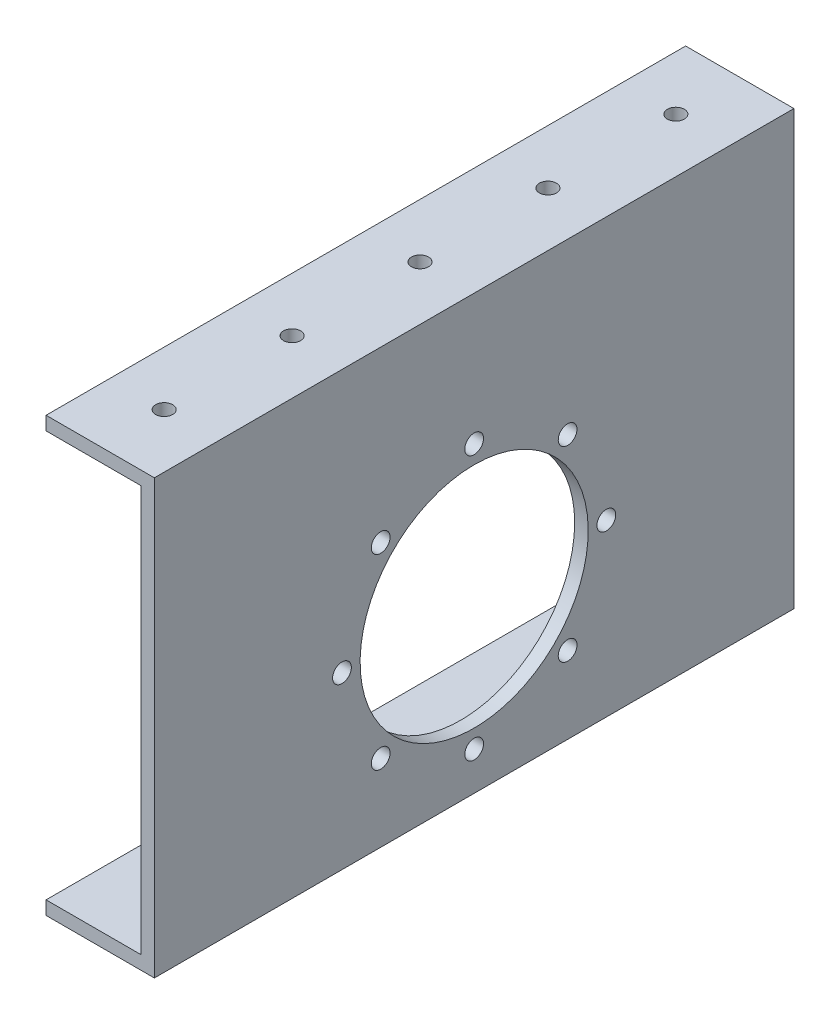
ISO-10303-21;
HEADER;
FILE_DESCRIPTION(('STEP AP214'),'2;1');
FILE_NAME('part.step','',(''),(''),'','','');
FILE_SCHEMA(('AUTOMOTIVE_DESIGN { 1 0 10303 214 1 1 1 1 }'));
ENDSEC;
DATA;
#1=APPLICATION_CONTEXT('core data for automotive mechanical design processes');
#2=APPLICATION_PROTOCOL_DEFINITION('international standard','automotive_design',2000,#1);
#3=PRODUCT_CONTEXT('',#1,'mechanical');
#4=PRODUCT('Part','Part','',(#3));
#5=PRODUCT_RELATED_PRODUCT_CATEGORY('part','',(#4));
#6=PRODUCT_DEFINITION_FORMATION('','',#4);
#7=PRODUCT_DEFINITION_CONTEXT('part definition',#1,'design');
#8=PRODUCT_DEFINITION('design','',#6,#7);
#9=PRODUCT_DEFINITION_SHAPE('','',#8);
#10=(LENGTH_UNIT() NAMED_UNIT(*) SI_UNIT(.MILLI.,.METRE.));
#11=(NAMED_UNIT(*) PLANE_ANGLE_UNIT() SI_UNIT($,.RADIAN.));
#12=(NAMED_UNIT(*) SI_UNIT($,.STERADIAN.) SOLID_ANGLE_UNIT());
#13=UNCERTAINTY_MEASURE_WITH_UNIT(LENGTH_MEASURE(1.E-05),#10,'distance_accuracy_value','');
#14=(GEOMETRIC_REPRESENTATION_CONTEXT(3) GLOBAL_UNCERTAINTY_ASSIGNED_CONTEXT((#13)) GLOBAL_UNIT_ASSIGNED_CONTEXT((#10,
#11,#12)) REPRESENTATION_CONTEXT('',''));
#15=CARTESIAN_POINT('',(0.,0.,0.));
#16=DIRECTION('',(0.,0.,1.));
#17=DIRECTION('',(1.,0.,0.));
#18=AXIS2_PLACEMENT_3D('',#15,#16,#17);
#19=CARTESIAN_POINT('',(0.,78.4633663366337,150.));
#20=DIRECTION('',(1.,0.,0.));
#21=DIRECTION('',(0.,0.,-1.));
#22=AXIS2_PLACEMENT_3D('',#19,#20,#21);
#23=PLANE('',#22);
#24=DIRECTION('',(0.,-1.,0.));
#25=VECTOR('',#24,1.);
#26=CARTESIAN_POINT('',(0.,78.4633663366337,0.));
#27=LINE('',#26,#25);
#28=CARTESIAN_POINT('',(0.,78.4633663366337,0.));
#29=VERTEX_POINT('',#28);
#30=CARTESIAN_POINT('',(0.,75.2883663366337,0.));
#31=VERTEX_POINT('',#30);
#32=EDGE_CURVE('E135',#29,#31,#27,.T.);
#33=ORIENTED_EDGE('',*,*,#32,.T.);
#34=DIRECTION('',(0.,0.,-1.));
#35=VECTOR('',#34,1.);
#36=CARTESIAN_POINT('',(0.,75.2883663366337,150.));
#37=LINE('',#36,#35);
#38=CARTESIAN_POINT('',(0.,75.2883663366337,150.));
#39=VERTEX_POINT('',#38);
#40=EDGE_CURVE('E11',#39,#31,#37,.T.);
#41=ORIENTED_EDGE('',*,*,#40,.F.);
#42=DIRECTION('',(0.,-1.,0.));
#43=VECTOR('',#42,1.);
#44=CARTESIAN_POINT('',(0.,78.4633663366337,150.));
#45=LINE('',#44,#43);
#46=CARTESIAN_POINT('',(0.,78.4633663366337,150.));
#47=VERTEX_POINT('',#46);
#48=EDGE_CURVE('E150',#47,#39,#45,.T.);
#49=ORIENTED_EDGE('',*,*,#48,.F.);
#50=DIRECTION('',(0.,0.,-1.));
#51=VECTOR('',#50,1.);
#52=CARTESIAN_POINT('',(0.,78.4633663366337,150.));
#53=LINE('',#52,#51);
#54=EDGE_CURVE('E131',#47,#29,#53,.T.);
#55=ORIENTED_EDGE('',*,*,#54,.T.);
#56=EDGE_LOOP('',(#33,#41,#49,#55));
#57=FACE_BOUND('',#56,.T.);
#58=ADVANCED_FACE('F39',(#57),#23,.F.);
#59=CARTESIAN_POINT('',(0.,75.2883663366337,150.));
#60=DIRECTION('',(0.,1.,0.));
#61=DIRECTION('',(0.,0.,1.));
#62=AXIS2_PLACEMENT_3D('',#59,#60,#61);
#63=PLANE('',#62);
#64=CARTESIAN_POINT('',(12.6999999999998,75.2883663366337,15.));
#65=DIRECTION('',(0.,1.,0.));
#66=DIRECTION('',(0.,0.,1.));
#67=AXIS2_PLACEMENT_3D('',#64,#65,#66);
#68=CIRCLE('',#67,2.);
#69=CARTESIAN_POINT('',(12.6999999999998,75.2883663366337,17.));
#70=VERTEX_POINT('',#69);
#71=EDGE_CURVE('E220',#70,#70,#68,.T.);
#72=ORIENTED_EDGE('',*,*,#71,.T.);
#73=EDGE_LOOP('',(#72));
#74=FACE_BOUND('',#73,.T.);
#75=CARTESIAN_POINT('',(12.6999999999999,75.2883663366337,45.));
#76=DIRECTION('',(0.,1.,0.));
#77=DIRECTION('',(0.,0.,1.));
#78=AXIS2_PLACEMENT_3D('',#75,#76,#77);
#79=CIRCLE('',#78,2.);
#80=CARTESIAN_POINT('',(12.6999999999999,75.2883663366337,47.));
#81=VERTEX_POINT('',#80);
#82=EDGE_CURVE('E242',#81,#81,#79,.T.);
#83=ORIENTED_EDGE('',*,*,#82,.T.);
#84=EDGE_LOOP('',(#83));
#85=FACE_BOUND('',#84,.T.);
#86=CARTESIAN_POINT('',(12.7000000000006,75.2883663366337,135.));
#87=DIRECTION('',(0.,1.,0.));
#88=DIRECTION('',(0.,0.,1.));
#89=AXIS2_PLACEMENT_3D('',#86,#87,#88);
#90=CIRCLE('',#89,2.);
#91=CARTESIAN_POINT('',(12.7000000000006,75.2883663366337,137.));
#92=VERTEX_POINT('',#91);
#93=EDGE_CURVE('E248',#92,#92,#90,.T.);
#94=ORIENTED_EDGE('',*,*,#93,.T.);
#95=EDGE_LOOP('',(#94));
#96=FACE_BOUND('',#95,.T.);
#97=CARTESIAN_POINT('',(12.7000000000003,75.2883663366337,105.));
#98=DIRECTION('',(0.,1.,0.));
#99=DIRECTION('',(0.,0.,1.));
#100=AXIS2_PLACEMENT_3D('',#97,#98,#99);
#101=CIRCLE('',#100,2.);
#102=CARTESIAN_POINT('',(12.7000000000003,75.2883663366337,107.));
#103=VERTEX_POINT('',#102);
#104=EDGE_CURVE('E254',#103,#103,#101,.T.);
#105=ORIENTED_EDGE('',*,*,#104,.T.);
#106=EDGE_LOOP('',(#105));
#107=FACE_BOUND('',#106,.T.);
#108=CARTESIAN_POINT('',(12.7,75.2883663366337,75.));
#109=DIRECTION('',(0.,1.,0.));
#110=DIRECTION('',(0.,0.,1.));
#111=AXIS2_PLACEMENT_3D('',#108,#109,#110);
#112=CIRCLE('',#111,2.);
#113=CARTESIAN_POINT('',(12.7,75.2883663366337,77.));
#114=VERTEX_POINT('',#113);
#115=EDGE_CURVE('E260',#114,#114,#112,.T.);
#116=ORIENTED_EDGE('',*,*,#115,.T.);
#117=EDGE_LOOP('',(#116));
#118=FACE_BOUND('',#117,.T.);
#119=DIRECTION('',(1.,0.,0.));
#120=VECTOR('',#119,1.);
#121=CARTESIAN_POINT('',(0.,75.2883663366337,0.));
#122=LINE('',#121,#120);
#123=CARTESIAN_POINT('',(22.225,75.2883663366337,0.));
#124=VERTEX_POINT('',#123);
#125=EDGE_CURVE('E138',#31,#124,#122,.T.);
#126=ORIENTED_EDGE('',*,*,#125,.T.);
#127=DIRECTION('',(0.,0.,-1.));
#128=VECTOR('',#127,1.);
#129=CARTESIAN_POINT('',(22.225,75.2883663366337,150.));
#130=LINE('',#129,#128);
#131=CARTESIAN_POINT('',(22.225,75.2883663366337,150.));
#132=VERTEX_POINT('',#131);
#133=EDGE_CURVE('E47',#132,#124,#130,.T.);
#134=ORIENTED_EDGE('',*,*,#133,.F.);
#135=DIRECTION('',(1.,0.,0.));
#136=VECTOR('',#135,1.);
#137=CARTESIAN_POINT('',(0.,75.2883663366337,150.));
#138=LINE('',#137,#136);
#139=EDGE_CURVE('E98',#39,#132,#138,.T.);
#140=ORIENTED_EDGE('',*,*,#139,.F.);
#141=ORIENTED_EDGE('',*,*,#40,.T.);
#142=EDGE_LOOP('',(#126,#134,#140,#141));
#143=FACE_BOUND('',#142,.T.);
#144=ADVANCED_FACE('F315',(#74,#85,#96,#107,#118,#143),#63,.F.);
#145=CARTESIAN_POINT('',(22.225,75.2883663366337,150.));
#146=DIRECTION('',(1.,0.,0.));
#147=DIRECTION('',(0.,0.,-1.));
#148=AXIS2_PLACEMENT_3D('',#145,#146,#147);
#149=PLANE('',#148);
#150=CARTESIAN_POINT('',(22.225,47.8633663366337,75.));
#151=DIRECTION('',(1.,0.,0.));
#152=DIRECTION('',(0.,0.,-1.));
#153=AXIS2_PLACEMENT_3D('',#150,#151,#152);
#154=CIRCLE('',#153,2.2);
#155=CARTESIAN_POINT('',(22.225,47.8633663366337,72.8));
#156=VERTEX_POINT('',#155);
#157=EDGE_CURVE('E188',#156,#156,#154,.F.);
#158=ORIENTED_EDGE('',*,*,#157,.F.);
#159=EDGE_LOOP('',(#158));
#160=FACE_BOUND('',#159,.T.);
#161=CARTESIAN_POINT('',(22.225,38.7836765534182,53.0796897832163));
#162=DIRECTION('',(1.,0.,0.));
#163=DIRECTION('',(0.,0.,-1.));
#164=AXIS2_PLACEMENT_3D('',#161,#162,#163);
#165=CIRCLE('',#164,2.2);
#166=CARTESIAN_POINT('',(22.225,38.7836765534182,50.8796897832163));
#167=VERTEX_POINT('',#166);
#168=EDGE_CURVE('E203',#167,#167,#165,.F.);
#169=ORIENTED_EDGE('',*,*,#168,.F.);
#170=EDGE_LOOP('',(#169));
#171=FACE_BOUND('',#170,.T.);
#172=CARTESIAN_POINT('',(22.225,16.8633663366357,43.9999999999978));
#173=DIRECTION('',(1.,0.,0.));
#174=DIRECTION('',(0.,0.,-1.));
#175=AXIS2_PLACEMENT_3D('',#172,#173,#174);
#176=CIRCLE('',#175,2.19999999999999);
#177=CARTESIAN_POINT('',(22.225,16.8633663366357,41.7999999999978));
#178=VERTEX_POINT('',#177);
#179=EDGE_CURVE('E197',#178,#178,#176,.F.);
#180=ORIENTED_EDGE('',*,*,#179,.F.);
#181=EDGE_LOOP('',(#180));
#182=FACE_BOUND('',#181,.T.);
#183=CARTESIAN_POINT('',(22.225,-5.05694388014786,53.0796897832134));
#184=DIRECTION('',(1.,0.,0.));
#185=DIRECTION('',(0.,0.,-1.));
#186=AXIS2_PLACEMENT_3D('',#183,#184,#185);
#187=CIRCLE('',#186,2.2);
#188=CARTESIAN_POINT('',(22.225,-5.05694388014786,50.8796897832134));
#189=VERTEX_POINT('',#188);
#190=EDGE_CURVE('E189',#189,#189,#187,.F.);
#191=ORIENTED_EDGE('',*,*,#190,.F.);
#192=EDGE_LOOP('',(#191));
#193=FACE_BOUND('',#192,.T.);
#194=CARTESIAN_POINT('',(22.225,-14.1366336633663,74.9999999999958));
#195=DIRECTION('',(1.,0.,0.));
#196=DIRECTION('',(0.,0.,-1.));
#197=AXIS2_PLACEMENT_3D('',#194,#195,#196);
#198=CIRCLE('',#197,2.19999999999999);
#199=CARTESIAN_POINT('',(22.225,-14.1366336633663,72.7999999999958));
#200=VERTEX_POINT('',#199);
#201=EDGE_CURVE('E196',#200,#200,#198,.F.);
#202=ORIENTED_EDGE('',*,*,#201,.F.);
#203=EDGE_LOOP('',(#202));
#204=FACE_BOUND('',#203,.T.);
#205=CARTESIAN_POINT('',(22.225,-5.05694388015063,96.9203102167794));
#206=DIRECTION('',(1.,0.,0.));
#207=DIRECTION('',(0.,0.,-1.));
#208=AXIS2_PLACEMENT_3D('',#205,#206,#207);
#209=CIRCLE('',#208,2.2);
#210=CARTESIAN_POINT('',(22.225,-5.05694388015063,94.7203102167794));
#211=VERTEX_POINT('',#210);
#212=EDGE_CURVE('E227',#211,#211,#209,.F.);
#213=ORIENTED_EDGE('',*,*,#212,.F.);
#214=EDGE_LOOP('',(#213));
#215=FACE_BOUND('',#214,.T.);
#216=CARTESIAN_POINT('',(22.225,16.8633663366318,105.999999999998));
#217=DIRECTION('',(1.,0.,0.));
#218=DIRECTION('',(0.,0.,-1.));
#219=AXIS2_PLACEMENT_3D('',#216,#217,#218);
#220=CIRCLE('',#219,2.20000000000001);
#221=CARTESIAN_POINT('',(22.225,16.8633663366318,103.799999999998));
#222=VERTEX_POINT('',#221);
#223=EDGE_CURVE('E221',#222,#222,#220,.F.);
#224=ORIENTED_EDGE('',*,*,#223,.F.);
#225=EDGE_LOOP('',(#224));
#226=FACE_BOUND('',#225,.T.);
#227=CARTESIAN_POINT('',(22.225,38.7836765534153,96.9203102167821));
#228=DIRECTION('',(1.,0.,0.));
#229=DIRECTION('',(0.,0.,-1.));
#230=AXIS2_PLACEMENT_3D('',#227,#228,#229);
#231=CIRCLE('',#230,2.2);
#232=CARTESIAN_POINT('',(22.225,38.7836765534153,94.7203102167821));
#233=VERTEX_POINT('',#232);
#234=EDGE_CURVE('E213',#233,#233,#231,.F.);
#235=ORIENTED_EDGE('',*,*,#234,.F.);
#236=EDGE_LOOP('',(#235));
#237=FACE_BOUND('',#236,.T.);
#238=CARTESIAN_POINT('',(22.225,16.8633663366337,75.));
#239=DIRECTION('',(1.,0.,0.));
#240=DIRECTION('',(0.,0.,-1.));
#241=AXIS2_PLACEMENT_3D('',#238,#239,#240);
#242=CIRCLE('',#241,26.75);
#243=CARTESIAN_POINT('',(22.225,16.8633663366337,48.25));
#244=VERTEX_POINT('',#243);
#245=EDGE_CURVE('E139',#244,#244,#242,.F.);
#246=ORIENTED_EDGE('',*,*,#245,.F.);
#247=EDGE_LOOP('',(#246));
#248=FACE_BOUND('',#247,.T.);
#249=DIRECTION('',(0.,-1.,0.));
#250=VECTOR('',#249,1.);
#251=CARTESIAN_POINT('',(22.225,75.2883663366337,0.));
#252=LINE('',#251,#250);
#253=CARTESIAN_POINT('',(22.225,-19.9616336633663,0.));
#254=VERTEX_POINT('',#253);
#255=EDGE_CURVE('E141',#124,#254,#252,.T.);
#256=ORIENTED_EDGE('',*,*,#255,.T.);
#257=DIRECTION('',(0.,0.,-1.));
#258=VECTOR('',#257,1.);
#259=CARTESIAN_POINT('',(22.225,-19.9616336633663,150.));
#260=LINE('',#259,#258);
#261=CARTESIAN_POINT('',(22.225,-19.9616336633663,150.));
#262=VERTEX_POINT('',#261);
#263=EDGE_CURVE('E157',#262,#254,#260,.T.);
#264=ORIENTED_EDGE('',*,*,#263,.F.);
#265=DIRECTION('',(0.,-1.,0.));
#266=VECTOR('',#265,1.);
#267=CARTESIAN_POINT('',(22.225,75.2883663366337,150.));
#268=LINE('',#267,#266);
#269=EDGE_CURVE('E165',#132,#262,#268,.T.);
#270=ORIENTED_EDGE('',*,*,#269,.F.);
#271=ORIENTED_EDGE('',*,*,#133,.T.);
#272=EDGE_LOOP('',(#256,#264,#270,#271));
#273=FACE_BOUND('',#272,.T.);
#274=ADVANCED_FACE('F163',(#160,#171,#182,#193,#204,#215,#226,#237,#248,#273),#149,.F.);
#275=CARTESIAN_POINT('',(22.225,-19.9616336633663,150.));
#276=DIRECTION('',(0.,-1.,0.));
#277=DIRECTION('',(0.,0.,-1.));
#278=AXIS2_PLACEMENT_3D('',#275,#276,#277);
#279=PLANE('',#278);
#280=CARTESIAN_POINT('',(12.6999999999998,-19.9616336633663,15.));
#281=DIRECTION('',(0.,-1.,0.));
#282=DIRECTION('',(0.,0.,-1.));
#283=AXIS2_PLACEMENT_3D('',#280,#281,#282);
#284=CIRCLE('',#283,2.);
#285=CARTESIAN_POINT('',(12.6999999999998,-19.9616336633663,13.));
#286=VERTEX_POINT('',#285);
#287=EDGE_CURVE('E239',#286,#286,#284,.T.);
#288=ORIENTED_EDGE('',*,*,#287,.T.);
#289=EDGE_LOOP('',(#288));
#290=FACE_BOUND('',#289,.T.);
#291=CARTESIAN_POINT('',(12.6999999999999,-19.9616336633663,45.));
#292=DIRECTION('',(0.,-1.,0.));
#293=DIRECTION('',(0.,0.,-1.));
#294=AXIS2_PLACEMENT_3D('',#291,#292,#293);
#295=CIRCLE('',#294,2.);
#296=CARTESIAN_POINT('',(12.6999999999999,-19.9616336633663,43.));
#297=VERTEX_POINT('',#296);
#298=EDGE_CURVE('E245',#297,#297,#295,.T.);
#299=ORIENTED_EDGE('',*,*,#298,.T.);
#300=EDGE_LOOP('',(#299));
#301=FACE_BOUND('',#300,.T.);
#302=CARTESIAN_POINT('',(12.7000000000006,-19.9616336633663,135.));
#303=DIRECTION('',(0.,-1.,0.));
#304=DIRECTION('',(0.,0.,-1.));
#305=AXIS2_PLACEMENT_3D('',#302,#303,#304);
#306=CIRCLE('',#305,2.);
#307=CARTESIAN_POINT('',(12.7000000000006,-19.9616336633663,133.));
#308=VERTEX_POINT('',#307);
#309=EDGE_CURVE('E251',#308,#308,#306,.T.);
#310=ORIENTED_EDGE('',*,*,#309,.T.);
#311=EDGE_LOOP('',(#310));
#312=FACE_BOUND('',#311,.T.);
#313=CARTESIAN_POINT('',(12.7000000000003,-19.9616336633663,105.));
#314=DIRECTION('',(0.,-1.,0.));
#315=DIRECTION('',(0.,0.,-1.));
#316=AXIS2_PLACEMENT_3D('',#313,#314,#315);
#317=CIRCLE('',#316,2.);
#318=CARTESIAN_POINT('',(12.7000000000003,-19.9616336633663,103.));
#319=VERTEX_POINT('',#318);
#320=EDGE_CURVE('E257',#319,#319,#317,.T.);
#321=ORIENTED_EDGE('',*,*,#320,.T.);
#322=EDGE_LOOP('',(#321));
#323=FACE_BOUND('',#322,.T.);
#324=CARTESIAN_POINT('',(12.7,-19.9616336633663,75.));
#325=DIRECTION('',(0.,-1.,0.));
#326=DIRECTION('',(0.,0.,-1.));
#327=AXIS2_PLACEMENT_3D('',#324,#325,#326);
#328=CIRCLE('',#327,2.);
#329=CARTESIAN_POINT('',(12.7,-19.9616336633663,73.));
#330=VERTEX_POINT('',#329);
#331=EDGE_CURVE('E263',#330,#330,#328,.T.);
#332=ORIENTED_EDGE('',*,*,#331,.T.);
#333=EDGE_LOOP('',(#332));
#334=FACE_BOUND('',#333,.T.);
#335=DIRECTION('',(-1.,0.,0.));
#336=VECTOR('',#335,1.);
#337=CARTESIAN_POINT('',(22.225,-19.9616336633663,0.));
#338=LINE('',#337,#336);
#339=CARTESIAN_POINT('',(0.,-19.9616336633663,0.));
#340=VERTEX_POINT('',#339);
#341=EDGE_CURVE('E143',#254,#340,#338,.T.);
#342=ORIENTED_EDGE('',*,*,#341,.T.);
#343=DIRECTION('',(0.,0.,-1.));
#344=VECTOR('',#343,1.);
#345=CARTESIAN_POINT('',(0.,-19.9616336633663,150.));
#346=LINE('',#345,#344);
#347=CARTESIAN_POINT('',(0.,-19.9616336633663,150.));
#348=VERTEX_POINT('',#347);
#349=EDGE_CURVE('E154',#348,#340,#346,.T.);
#350=ORIENTED_EDGE('',*,*,#349,.F.);
#351=DIRECTION('',(-1.,0.,0.));
#352=VECTOR('',#351,1.);
#353=CARTESIAN_POINT('',(22.225,-19.9616336633663,150.));
#354=LINE('',#353,#352);
#355=EDGE_CURVE('E177',#262,#348,#354,.T.);
#356=ORIENTED_EDGE('',*,*,#355,.F.);
#357=ORIENTED_EDGE('',*,*,#263,.T.);
#358=EDGE_LOOP('',(#342,#350,#356,#357));
#359=FACE_BOUND('',#358,.T.);
#360=ADVANCED_FACE('F173',(#290,#301,#312,#323,#334,#359),#279,.F.);
#361=CARTESIAN_POINT('',(0.,-23.1366336633663,150.));
#362=DIRECTION('',(1.,0.,0.));
#363=DIRECTION('',(0.,0.,-1.));
#364=AXIS2_PLACEMENT_3D('',#361,#362,#363);
#365=PLANE('',#364);
#366=DIRECTION('',(0.,-1.,0.));
#367=VECTOR('',#366,1.);
#368=CARTESIAN_POINT('',(0.,-23.1366336633663,0.));
#369=LINE('',#368,#367);
#370=CARTESIAN_POINT('',(0.,-23.1366336633663,0.));
#371=VERTEX_POINT('',#370);
#372=EDGE_CURVE('E145',#340,#371,#369,.T.);
#373=ORIENTED_EDGE('',*,*,#372,.T.);
#374=DIRECTION('',(0.,0.,-1.));
#375=VECTOR('',#374,1.);
#376=CARTESIAN_POINT('',(0.,-23.1366336633663,150.));
#377=LINE('',#376,#375);
#378=CARTESIAN_POINT('',(0.,-23.1366336633663,150.));
#379=VERTEX_POINT('',#378);
#380=EDGE_CURVE('E126',#379,#371,#377,.T.);
#381=ORIENTED_EDGE('',*,*,#380,.F.);
#382=DIRECTION('',(0.,-1.,0.));
#383=VECTOR('',#382,1.);
#384=CARTESIAN_POINT('',(0.,-23.1366336633663,150.));
#385=LINE('',#384,#383);
#386=EDGE_CURVE('E117',#348,#379,#385,.T.);
#387=ORIENTED_EDGE('',*,*,#386,.F.);
#388=ORIENTED_EDGE('',*,*,#349,.T.);
#389=EDGE_LOOP('',(#373,#381,#387,#388));
#390=FACE_BOUND('',#389,.T.);
#391=ADVANCED_FACE('F176',(#390),#365,.F.);
#392=CARTESIAN_POINT('',(25.4,-23.1366336633663,150.));
#393=DIRECTION('',(0.,1.,0.));
#394=DIRECTION('',(0.,0.,1.));
#395=AXIS2_PLACEMENT_3D('',#392,#393,#394);
#396=PLANE('',#395);
#397=CARTESIAN_POINT('',(12.6999999999998,-23.1366336633663,15.));
#398=DIRECTION('',(0.,1.,0.));
#399=DIRECTION('',(0.,0.,1.));
#400=AXIS2_PLACEMENT_3D('',#397,#398,#399);
#401=CIRCLE('',#400,2.);
#402=CARTESIAN_POINT('',(12.6999999999998,-23.1366336633663,17.));
#403=VERTEX_POINT('',#402);
#404=EDGE_CURVE('E273',#403,#403,#401,.F.);
#405=ORIENTED_EDGE('',*,*,#404,.F.);
#406=EDGE_LOOP('',(#405));
#407=FACE_BOUND('',#406,.T.);
#408=CARTESIAN_POINT('',(12.6999999999999,-23.1366336633663,45.));
#409=DIRECTION('',(0.,1.,0.));
#410=DIRECTION('',(0.,0.,1.));
#411=AXIS2_PLACEMENT_3D('',#408,#409,#410);
#412=CIRCLE('',#411,2.);
#413=CARTESIAN_POINT('',(12.6999999999999,-23.1366336633663,47.));
#414=VERTEX_POINT('',#413);
#415=EDGE_CURVE('E280',#414,#414,#412,.F.);
#416=ORIENTED_EDGE('',*,*,#415,.F.);
#417=EDGE_LOOP('',(#416));
#418=FACE_BOUND('',#417,.T.);
#419=CARTESIAN_POINT('',(12.7000000000006,-23.1366336633663,135.));
#420=DIRECTION('',(0.,1.,0.));
#421=DIRECTION('',(0.,0.,1.));
#422=AXIS2_PLACEMENT_3D('',#419,#420,#421);
#423=CIRCLE('',#422,2.);
#424=CARTESIAN_POINT('',(12.7000000000006,-23.1366336633663,137.));
#425=VERTEX_POINT('',#424);
#426=EDGE_CURVE('E286',#425,#425,#423,.F.);
#427=ORIENTED_EDGE('',*,*,#426,.F.);
#428=EDGE_LOOP('',(#427));
#429=FACE_BOUND('',#428,.T.);
#430=CARTESIAN_POINT('',(12.7000000000003,-23.1366336633663,105.));
#431=DIRECTION('',(0.,1.,0.));
#432=DIRECTION('',(0.,0.,1.));
#433=AXIS2_PLACEMENT_3D('',#430,#431,#432);
#434=CIRCLE('',#433,2.);
#435=CARTESIAN_POINT('',(12.7000000000003,-23.1366336633663,107.));
#436=VERTEX_POINT('',#435);
#437=EDGE_CURVE('E272',#436,#436,#434,.F.);
#438=ORIENTED_EDGE('',*,*,#437,.F.);
#439=EDGE_LOOP('',(#438));
#440=FACE_BOUND('',#439,.T.);
#441=CARTESIAN_POINT('',(12.7,-23.1366336633663,75.));
#442=DIRECTION('',(0.,1.,0.));
#443=DIRECTION('',(0.,0.,1.));
#444=AXIS2_PLACEMENT_3D('',#441,#442,#443);
#445=CIRCLE('',#444,2.);
#446=CARTESIAN_POINT('',(12.7,-23.1366336633663,77.));
#447=VERTEX_POINT('',#446);
#448=EDGE_CURVE('E266',#447,#447,#445,.F.);
#449=ORIENTED_EDGE('',*,*,#448,.F.);
#450=EDGE_LOOP('',(#449));
#451=FACE_BOUND('',#450,.T.);
#452=DIRECTION('',(1.,0.,0.));
#453=VECTOR('',#452,1.);
#454=CARTESIAN_POINT('',(25.4,-23.1366336633663,0.));
#455=LINE('',#454,#453);
#456=CARTESIAN_POINT('',(25.4,-23.1366336633663,0.));
#457=VERTEX_POINT('',#456);
#458=EDGE_CURVE('E125',#371,#457,#455,.T.);
#459=ORIENTED_EDGE('',*,*,#458,.T.);
#460=DIRECTION('',(0.,0.,-1.));
#461=VECTOR('',#460,1.);
#462=CARTESIAN_POINT('',(25.4,-23.1366336633663,150.));
#463=LINE('',#462,#461);
#464=CARTESIAN_POINT('',(25.4,-23.1366336633663,150.));
#465=VERTEX_POINT('',#464);
#466=EDGE_CURVE('E122',#465,#457,#463,.T.);
#467=ORIENTED_EDGE('',*,*,#466,.F.);
#468=DIRECTION('',(1.,0.,0.));
#469=VECTOR('',#468,1.);
#470=CARTESIAN_POINT('',(25.4,-23.1366336633663,150.));
#471=LINE('',#470,#469);
#472=EDGE_CURVE('E111',#379,#465,#471,.T.);
#473=ORIENTED_EDGE('',*,*,#472,.F.);
#474=ORIENTED_EDGE('',*,*,#380,.T.);
#475=EDGE_LOOP('',(#459,#467,#473,#474));
#476=FACE_BOUND('',#475,.T.);
#477=ADVANCED_FACE('F123',(#407,#418,#429,#440,#451,#476),#396,.F.);
#478=CARTESIAN_POINT('',(25.4,78.4633663366337,150.));
#479=DIRECTION('',(-1.,0.,0.));
#480=DIRECTION('',(0.,-1.,0.));
#481=AXIS2_PLACEMENT_3D('',#478,#479,#480);
#482=PLANE('',#481);
#483=CARTESIAN_POINT('',(25.4,47.8633663366337,75.));
#484=DIRECTION('',(1.,0.,0.));
#485=DIRECTION('',(0.,1.,0.));
#486=AXIS2_PLACEMENT_3D('',#483,#484,#485);
#487=CIRCLE('',#486,2.2);
#488=CARTESIAN_POINT('',(25.4,50.0633663366337,75.));
#489=VERTEX_POINT('',#488);
#490=EDGE_CURVE('E206',#489,#489,#487,.T.);
#491=ORIENTED_EDGE('',*,*,#490,.F.);
#492=EDGE_LOOP('',(#491));
#493=FACE_BOUND('',#492,.T.);
#494=CARTESIAN_POINT('',(25.4,38.7836765534182,53.0796897832163));
#495=DIRECTION('',(1.,0.,0.));
#496=DIRECTION('',(0.,1.,0.));
#497=AXIS2_PLACEMENT_3D('',#494,#495,#496);
#498=CIRCLE('',#497,2.2);
#499=CARTESIAN_POINT('',(25.4,40.9836765534181,53.0796897832163));
#500=VERTEX_POINT('',#499);
#501=EDGE_CURVE('E200',#500,#500,#498,.T.);
#502=ORIENTED_EDGE('',*,*,#501,.F.);
#503=EDGE_LOOP('',(#502));
#504=FACE_BOUND('',#503,.T.);
#505=CARTESIAN_POINT('',(25.4,16.8633663366358,43.9999999999978));
#506=DIRECTION('',(1.,0.,0.));
#507=DIRECTION('',(0.,1.,0.));
#508=AXIS2_PLACEMENT_3D('',#505,#506,#507);
#509=CIRCLE('',#508,2.19999999999999);
#510=CARTESIAN_POINT('',(25.4,19.0633663366357,43.9999999999978));
#511=VERTEX_POINT('',#510);
#512=EDGE_CURVE('E192',#511,#511,#509,.T.);
#513=ORIENTED_EDGE('',*,*,#512,.F.);
#514=EDGE_LOOP('',(#513));
#515=FACE_BOUND('',#514,.T.);
#516=CARTESIAN_POINT('',(25.4,-5.05694388014786,53.0796897832134));
#517=DIRECTION('',(1.,0.,0.));
#518=DIRECTION('',(0.,1.,0.));
#519=AXIS2_PLACEMENT_3D('',#516,#517,#518);
#520=CIRCLE('',#519,2.2);
#521=CARTESIAN_POINT('',(25.4,-2.85694388014786,53.0796897832134));
#522=VERTEX_POINT('',#521);
#523=EDGE_CURVE('E193',#522,#522,#520,.T.);
#524=ORIENTED_EDGE('',*,*,#523,.F.);
#525=EDGE_LOOP('',(#524));
#526=FACE_BOUND('',#525,.T.);
#527=CARTESIAN_POINT('',(25.4,-14.1366336633663,74.9999999999958));
#528=DIRECTION('',(1.,0.,0.));
#529=DIRECTION('',(0.,1.,0.));
#530=AXIS2_PLACEMENT_3D('',#527,#528,#529);
#531=CIRCLE('',#530,2.19999999999999);
#532=CARTESIAN_POINT('',(25.4,-11.9366336633663,74.9999999999958));
#533=VERTEX_POINT('',#532);
#534=EDGE_CURVE('E230',#533,#533,#531,.T.);
#535=ORIENTED_EDGE('',*,*,#534,.F.);
#536=EDGE_LOOP('',(#535));
#537=FACE_BOUND('',#536,.T.);
#538=CARTESIAN_POINT('',(25.4,-5.05694388015063,96.9203102167794));
#539=DIRECTION('',(1.,0.,0.));
#540=DIRECTION('',(0.,1.,0.));
#541=AXIS2_PLACEMENT_3D('',#538,#539,#540);
#542=CIRCLE('',#541,2.2);
#543=CARTESIAN_POINT('',(25.4,-2.85694388015063,96.9203102167794));
#544=VERTEX_POINT('',#543);
#545=EDGE_CURVE('E224',#544,#544,#542,.T.);
#546=ORIENTED_EDGE('',*,*,#545,.F.);
#547=EDGE_LOOP('',(#546));
#548=FACE_BOUND('',#547,.T.);
#549=CARTESIAN_POINT('',(25.4,16.8633663366318,105.999999999998));
#550=DIRECTION('',(1.,0.,0.));
#551=DIRECTION('',(0.,1.,0.));
#552=AXIS2_PLACEMENT_3D('',#549,#550,#551);
#553=CIRCLE('',#552,2.20000000000001);
#554=CARTESIAN_POINT('',(25.4,19.0633663366318,105.999999999998));
#555=VERTEX_POINT('',#554);
#556=EDGE_CURVE('E216',#555,#555,#553,.T.);
#557=ORIENTED_EDGE('',*,*,#556,.F.);
#558=EDGE_LOOP('',(#557));
#559=FACE_BOUND('',#558,.T.);
#560=CARTESIAN_POINT('',(25.4,38.7836765534153,96.9203102167821));
#561=DIRECTION('',(1.,0.,0.));
#562=DIRECTION('',(0.,1.,0.));
#563=AXIS2_PLACEMENT_3D('',#560,#561,#562);
#564=CIRCLE('',#563,2.2);
#565=CARTESIAN_POINT('',(25.4,40.9836765534153,96.9203102167821));
#566=VERTEX_POINT('',#565);
#567=EDGE_CURVE('E217',#566,#566,#564,.T.);
#568=ORIENTED_EDGE('',*,*,#567,.F.);
#569=EDGE_LOOP('',(#568));
#570=FACE_BOUND('',#569,.T.);
#571=CARTESIAN_POINT('',(25.4,16.8633663366337,75.));
#572=DIRECTION('',(1.,0.,0.));
#573=DIRECTION('',(0.,1.,0.));
#574=AXIS2_PLACEMENT_3D('',#571,#572,#573);
#575=CIRCLE('',#574,26.75);
#576=CARTESIAN_POINT('',(25.4,43.6133663366337,75.));
#577=VERTEX_POINT('',#576);
#578=EDGE_CURVE('E185',#577,#577,#575,.T.);
#579=ORIENTED_EDGE('',*,*,#578,.F.);
#580=EDGE_LOOP('',(#579));
#581=FACE_BOUND('',#580,.T.);
#582=DIRECTION('',(0.,1.,0.));
#583=VECTOR('',#582,1.);
#584=CARTESIAN_POINT('',(25.4,78.4633663366337,0.));
#585=LINE('',#584,#583);
#586=CARTESIAN_POINT('',(25.4,78.4633663366337,0.));
#587=VERTEX_POINT('',#586);
#588=EDGE_CURVE('E84',#457,#587,#585,.T.);
#589=ORIENTED_EDGE('',*,*,#588,.T.);
#590=DIRECTION('',(0.,0.,-1.));
#591=VECTOR('',#590,1.);
#592=CARTESIAN_POINT('',(25.4,78.4633663366337,150.));
#593=LINE('',#592,#591);
#594=CARTESIAN_POINT('',(25.4,78.4633663366337,150.));
#595=VERTEX_POINT('',#594);
#596=EDGE_CURVE('E127',#595,#587,#593,.T.);
#597=ORIENTED_EDGE('',*,*,#596,.F.);
#598=DIRECTION('',(0.,1.,0.));
#599=VECTOR('',#598,1.);
#600=CARTESIAN_POINT('',(25.4,78.4633663366337,150.));
#601=LINE('',#600,#599);
#602=EDGE_CURVE('E115',#465,#595,#601,.T.);
#603=ORIENTED_EDGE('',*,*,#602,.F.);
#604=ORIENTED_EDGE('',*,*,#466,.T.);
#605=EDGE_LOOP('',(#589,#597,#603,#604));
#606=FACE_BOUND('',#605,.T.);
#607=ADVANCED_FACE('F129',(#493,#504,#515,#526,#537,#548,#559,#570,#581,#606),#482,.F.);
#608=CARTESIAN_POINT('',(0.,78.4633663366337,150.));
#609=DIRECTION('',(0.,-1.,0.));
#610=DIRECTION('',(0.,0.,-1.));
#611=AXIS2_PLACEMENT_3D('',#608,#609,#610);
#612=PLANE('',#611);
#613=CARTESIAN_POINT('',(12.6999999999998,78.4633663366337,15.));
#614=DIRECTION('',(0.,1.,0.));
#615=DIRECTION('',(0.,0.,1.));
#616=AXIS2_PLACEMENT_3D('',#613,#614,#615);
#617=CIRCLE('',#616,2.);
#618=CARTESIAN_POINT('',(12.6999999999998,78.4633663366337,17.));
#619=VERTEX_POINT('',#618);
#620=EDGE_CURVE('E277',#619,#619,#617,.T.);
#621=ORIENTED_EDGE('',*,*,#620,.F.);
#622=EDGE_LOOP('',(#621));
#623=FACE_BOUND('',#622,.T.);
#624=CARTESIAN_POINT('',(12.6999999999999,78.4633663366337,45.));
#625=DIRECTION('',(0.,1.,0.));
#626=DIRECTION('',(0.,0.,1.));
#627=AXIS2_PLACEMENT_3D('',#624,#625,#626);
#628=CIRCLE('',#627,2.);
#629=CARTESIAN_POINT('',(12.6999999999999,78.4633663366337,47.));
#630=VERTEX_POINT('',#629);
#631=EDGE_CURVE('E276',#630,#630,#628,.T.);
#632=ORIENTED_EDGE('',*,*,#631,.F.);
#633=EDGE_LOOP('',(#632));
#634=FACE_BOUND('',#633,.T.);
#635=CARTESIAN_POINT('',(12.7000000000006,78.4633663366337,135.));
#636=DIRECTION('',(0.,1.,0.));
#637=DIRECTION('',(0.,0.,1.));
#638=AXIS2_PLACEMENT_3D('',#635,#636,#637);
#639=CIRCLE('',#638,2.);
#640=CARTESIAN_POINT('',(12.7000000000006,78.4633663366337,137.));
#641=VERTEX_POINT('',#640);
#642=EDGE_CURVE('E283',#641,#641,#639,.T.);
#643=ORIENTED_EDGE('',*,*,#642,.F.);
#644=EDGE_LOOP('',(#643));
#645=FACE_BOUND('',#644,.T.);
#646=CARTESIAN_POINT('',(12.7000000000003,78.4633663366337,105.));
#647=DIRECTION('',(0.,1.,0.));
#648=DIRECTION('',(0.,0.,1.));
#649=AXIS2_PLACEMENT_3D('',#646,#647,#648);
#650=CIRCLE('',#649,2.);
#651=CARTESIAN_POINT('',(12.7000000000003,78.4633663366337,107.));
#652=VERTEX_POINT('',#651);
#653=EDGE_CURVE('E289',#652,#652,#650,.T.);
#654=ORIENTED_EDGE('',*,*,#653,.F.);
#655=EDGE_LOOP('',(#654));
#656=FACE_BOUND('',#655,.T.);
#657=CARTESIAN_POINT('',(12.7,78.4633663366337,75.));
#658=DIRECTION('',(0.,1.,0.));
#659=DIRECTION('',(0.,0.,1.));
#660=AXIS2_PLACEMENT_3D('',#657,#658,#659);
#661=CIRCLE('',#660,2.);
#662=CARTESIAN_POINT('',(12.7,78.4633663366337,77.));
#663=VERTEX_POINT('',#662);
#664=EDGE_CURVE('E269',#663,#663,#661,.T.);
#665=ORIENTED_EDGE('',*,*,#664,.F.);
#666=EDGE_LOOP('',(#665));
#667=FACE_BOUND('',#666,.T.);
#668=DIRECTION('',(-1.,0.,0.));
#669=VECTOR('',#668,1.);
#670=CARTESIAN_POINT('',(0.,78.4633663366337,0.));
#671=LINE('',#670,#669);
#672=EDGE_CURVE('E90',#587,#29,#671,.T.);
#673=ORIENTED_EDGE('',*,*,#672,.T.);
#674=ORIENTED_EDGE('',*,*,#54,.F.);
#675=DIRECTION('',(-1.,0.,0.));
#676=VECTOR('',#675,1.);
#677=CARTESIAN_POINT('',(0.,78.4633663366337,150.));
#678=LINE('',#677,#676);
#679=EDGE_CURVE('E55',#595,#47,#678,.T.);
#680=ORIENTED_EDGE('',*,*,#679,.F.);
#681=ORIENTED_EDGE('',*,*,#596,.T.);
#682=EDGE_LOOP('',(#673,#674,#680,#681));
#683=FACE_BOUND('',#682,.T.);
#684=ADVANCED_FACE('F300',(#623,#634,#645,#656,#667,#683),#612,.F.);
#685=CARTESIAN_POINT('',(0.,0.,150.));
#686=DIRECTION('',(0.,0.,1.));
#687=DIRECTION('',(1.,0.,0.));
#688=AXIS2_PLACEMENT_3D('',#685,#686,#687);
#689=PLANE('',#688);
#690=ORIENTED_EDGE('',*,*,#48,.T.);
#691=ORIENTED_EDGE('',*,*,#139,.T.);
#692=ORIENTED_EDGE('',*,*,#269,.T.);
#693=ORIENTED_EDGE('',*,*,#355,.T.);
#694=ORIENTED_EDGE('',*,*,#386,.T.);
#695=ORIENTED_EDGE('',*,*,#472,.T.);
#696=ORIENTED_EDGE('',*,*,#602,.T.);
#697=ORIENTED_EDGE('',*,*,#679,.T.);
#698=EDGE_LOOP('',(#690,#691,#692,#693,#694,#695,#696,#697));
#699=FACE_BOUND('',#698,.T.);
#700=ADVANCED_FACE('F113',(#699),#689,.T.);
#701=CARTESIAN_POINT('',(0.,0.,0.));
#702=DIRECTION('',(0.,0.,1.));
#703=DIRECTION('',(1.,0.,0.));
#704=AXIS2_PLACEMENT_3D('',#701,#702,#703);
#705=PLANE('',#704);
#706=ORIENTED_EDGE('',*,*,#32,.F.);
#707=ORIENTED_EDGE('',*,*,#672,.F.);
#708=ORIENTED_EDGE('',*,*,#588,.F.);
#709=ORIENTED_EDGE('',*,*,#458,.F.);
#710=ORIENTED_EDGE('',*,*,#372,.F.);
#711=ORIENTED_EDGE('',*,*,#341,.F.);
#712=ORIENTED_EDGE('',*,*,#255,.F.);
#713=ORIENTED_EDGE('',*,*,#125,.F.);
#714=EDGE_LOOP('',(#706,#707,#708,#709,#710,#711,#712,#713));
#715=FACE_BOUND('',#714,.T.);
#716=ADVANCED_FACE('F169',(#715),#705,.F.);
#717=CARTESIAN_POINT('',(-53.4354255869606,16.8633663366337,75.));
#718=DIRECTION('',(1.,0.,0.));
#719=DIRECTION('',(0.,1.,0.));
#720=AXIS2_PLACEMENT_3D('',#717,#718,#719);
#721=CYLINDRICAL_SURFACE('',#720,26.75);
#722=ORIENTED_EDGE('',*,*,#245,.T.);
#723=EDGE_LOOP('',(#722));
#724=FACE_BOUND('',#723,.T.);
#725=ORIENTED_EDGE('',*,*,#578,.T.);
#726=EDGE_LOOP('',(#725));
#727=FACE_BOUND('',#726,.T.);
#728=ADVANCED_FACE('F381',(#724,#727),#721,.F.);
#729=CARTESIAN_POINT('',(-53.4354255869606,38.7836765534153,96.9203102167821));
#730=DIRECTION('',(1.,0.,0.));
#731=DIRECTION('',(0.,1.,0.));
#732=AXIS2_PLACEMENT_3D('',#729,#730,#731);
#733=CYLINDRICAL_SURFACE('',#732,2.2);
#734=ORIENTED_EDGE('',*,*,#234,.T.);
#735=EDGE_LOOP('',(#734));
#736=FACE_BOUND('',#735,.T.);
#737=ORIENTED_EDGE('',*,*,#567,.T.);
#738=EDGE_LOOP('',(#737));
#739=FACE_BOUND('',#738,.T.);
#740=ADVANCED_FACE('F387',(#736,#739),#733,.F.);
#741=CARTESIAN_POINT('',(-53.4354255869606,16.8633663366318,105.999999999998));
#742=DIRECTION('',(1.,0.,0.));
#743=DIRECTION('',(0.,1.,0.));
#744=AXIS2_PLACEMENT_3D('',#741,#742,#743);
#745=CYLINDRICAL_SURFACE('',#744,2.20000000000001);
#746=ORIENTED_EDGE('',*,*,#223,.T.);
#747=EDGE_LOOP('',(#746));
#748=FACE_BOUND('',#747,.T.);
#749=ORIENTED_EDGE('',*,*,#556,.T.);
#750=EDGE_LOOP('',(#749));
#751=FACE_BOUND('',#750,.T.);
#752=ADVANCED_FACE('F395',(#748,#751),#745,.F.);
#753=CARTESIAN_POINT('',(-53.4354255869606,-5.05694388015063,96.9203102167794));
#754=DIRECTION('',(1.,0.,0.));
#755=DIRECTION('',(0.,1.,0.));
#756=AXIS2_PLACEMENT_3D('',#753,#754,#755);
#757=CYLINDRICAL_SURFACE('',#756,2.2);
#758=ORIENTED_EDGE('',*,*,#212,.T.);
#759=EDGE_LOOP('',(#758));
#760=FACE_BOUND('',#759,.T.);
#761=ORIENTED_EDGE('',*,*,#545,.T.);
#762=EDGE_LOOP('',(#761));
#763=FACE_BOUND('',#762,.T.);
#764=ADVANCED_FACE('F403',(#760,#763),#757,.F.);
#765=CARTESIAN_POINT('',(-53.4354255869606,-14.1366336633663,74.9999999999958));
#766=DIRECTION('',(1.,0.,0.));
#767=DIRECTION('',(0.,1.,0.));
#768=AXIS2_PLACEMENT_3D('',#765,#766,#767);
#769=CYLINDRICAL_SURFACE('',#768,2.19999999999999);
#770=ORIENTED_EDGE('',*,*,#201,.T.);
#771=EDGE_LOOP('',(#770));
#772=FACE_BOUND('',#771,.T.);
#773=ORIENTED_EDGE('',*,*,#534,.T.);
#774=EDGE_LOOP('',(#773));
#775=FACE_BOUND('',#774,.T.);
#776=ADVANCED_FACE('F411',(#772,#775),#769,.F.);
#777=CARTESIAN_POINT('',(-53.4354255869606,-5.05694388014786,53.0796897832134));
#778=DIRECTION('',(1.,0.,0.));
#779=DIRECTION('',(0.,1.,0.));
#780=AXIS2_PLACEMENT_3D('',#777,#778,#779);
#781=CYLINDRICAL_SURFACE('',#780,2.2);
#782=ORIENTED_EDGE('',*,*,#190,.T.);
#783=EDGE_LOOP('',(#782));
#784=FACE_BOUND('',#783,.T.);
#785=ORIENTED_EDGE('',*,*,#523,.T.);
#786=EDGE_LOOP('',(#785));
#787=FACE_BOUND('',#786,.T.);
#788=ADVANCED_FACE('F419',(#784,#787),#781,.F.);
#789=CARTESIAN_POINT('',(-53.4354255869606,16.8633663366357,43.9999999999978));
#790=DIRECTION('',(1.,0.,0.));
#791=DIRECTION('',(0.,1.,0.));
#792=AXIS2_PLACEMENT_3D('',#789,#790,#791);
#793=CYLINDRICAL_SURFACE('',#792,2.19999999999999);
#794=ORIENTED_EDGE('',*,*,#179,.T.);
#795=EDGE_LOOP('',(#794));
#796=FACE_BOUND('',#795,.T.);
#797=ORIENTED_EDGE('',*,*,#512,.T.);
#798=EDGE_LOOP('',(#797));
#799=FACE_BOUND('',#798,.T.);
#800=ADVANCED_FACE('F427',(#796,#799),#793,.F.);
#801=CARTESIAN_POINT('',(-53.4354255869606,38.7836765534181,53.0796897832163));
#802=DIRECTION('',(1.,0.,0.));
#803=DIRECTION('',(0.,1.,0.));
#804=AXIS2_PLACEMENT_3D('',#801,#802,#803);
#805=CYLINDRICAL_SURFACE('',#804,2.2);
#806=ORIENTED_EDGE('',*,*,#168,.T.);
#807=EDGE_LOOP('',(#806));
#808=FACE_BOUND('',#807,.T.);
#809=ORIENTED_EDGE('',*,*,#501,.T.);
#810=EDGE_LOOP('',(#809));
#811=FACE_BOUND('',#810,.T.);
#812=ADVANCED_FACE('F435',(#808,#811),#805,.F.);
#813=CARTESIAN_POINT('',(-53.4354255869606,47.8633663366337,75.));
#814=DIRECTION('',(1.,0.,0.));
#815=DIRECTION('',(0.,1.,0.));
#816=AXIS2_PLACEMENT_3D('',#813,#814,#815);
#817=CYLINDRICAL_SURFACE('',#816,2.2);
#818=ORIENTED_EDGE('',*,*,#157,.T.);
#819=EDGE_LOOP('',(#818));
#820=FACE_BOUND('',#819,.T.);
#821=ORIENTED_EDGE('',*,*,#490,.T.);
#822=EDGE_LOOP('',(#821));
#823=FACE_BOUND('',#822,.T.);
#824=ADVANCED_FACE('F310',(#820,#823),#817,.F.);
#825=CARTESIAN_POINT('',(12.7,-28.7934879128587,75.));
#826=DIRECTION('',(0.,1.,0.));
#827=DIRECTION('',(0.,0.,1.));
#828=AXIS2_PLACEMENT_3D('',#825,#826,#827);
#829=CYLINDRICAL_SURFACE('',#828,2.);
#830=ORIENTED_EDGE('',*,*,#664,.T.);
#831=EDGE_LOOP('',(#830));
#832=FACE_BOUND('',#831,.T.);
#833=ORIENTED_EDGE('',*,*,#115,.F.);
#834=EDGE_LOOP('',(#833));
#835=FACE_BOUND('',#834,.T.);
#836=ADVANCED_FACE('F307',(#832,#835),#829,.F.);
#837=CARTESIAN_POINT('',(12.7000000000003,-28.7934879128587,105.));
#838=DIRECTION('',(0.,1.,0.));
#839=DIRECTION('',(0.,0.,1.));
#840=AXIS2_PLACEMENT_3D('',#837,#838,#839);
#841=CYLINDRICAL_SURFACE('',#840,2.);
#842=ORIENTED_EDGE('',*,*,#653,.T.);
#843=EDGE_LOOP('',(#842));
#844=FACE_BOUND('',#843,.T.);
#845=ORIENTED_EDGE('',*,*,#104,.F.);
#846=EDGE_LOOP('',(#845));
#847=FACE_BOUND('',#846,.T.);
#848=ADVANCED_FACE('F297',(#844,#847),#841,.F.);
#849=CARTESIAN_POINT('',(12.7000000000006,-28.7934879128587,135.));
#850=DIRECTION('',(0.,1.,0.));
#851=DIRECTION('',(0.,0.,1.));
#852=AXIS2_PLACEMENT_3D('',#849,#850,#851);
#853=CYLINDRICAL_SURFACE('',#852,2.);
#854=ORIENTED_EDGE('',*,*,#642,.T.);
#855=EDGE_LOOP('',(#854));
#856=FACE_BOUND('',#855,.T.);
#857=ORIENTED_EDGE('',*,*,#93,.F.);
#858=EDGE_LOOP('',(#857));
#859=FACE_BOUND('',#858,.T.);
#860=ADVANCED_FACE('F459',(#856,#859),#853,.F.);
#861=CARTESIAN_POINT('',(12.6999999999999,-28.7934879128587,45.));
#862=DIRECTION('',(0.,1.,0.));
#863=DIRECTION('',(0.,0.,1.));
#864=AXIS2_PLACEMENT_3D('',#861,#862,#863);
#865=CYLINDRICAL_SURFACE('',#864,2.);
#866=ORIENTED_EDGE('',*,*,#631,.T.);
#867=EDGE_LOOP('',(#866));
#868=FACE_BOUND('',#867,.T.);
#869=ORIENTED_EDGE('',*,*,#82,.F.);
#870=EDGE_LOOP('',(#869));
#871=FACE_BOUND('',#870,.T.);
#872=ADVANCED_FACE('F467',(#868,#871),#865,.F.);
#873=CARTESIAN_POINT('',(12.6999999999998,-28.7934879128587,15.));
#874=DIRECTION('',(0.,1.,0.));
#875=DIRECTION('',(0.,0.,1.));
#876=AXIS2_PLACEMENT_3D('',#873,#874,#875);
#877=CYLINDRICAL_SURFACE('',#876,2.);
#878=ORIENTED_EDGE('',*,*,#620,.T.);
#879=EDGE_LOOP('',(#878));
#880=FACE_BOUND('',#879,.T.);
#881=ORIENTED_EDGE('',*,*,#71,.F.);
#882=EDGE_LOOP('',(#881));
#883=FACE_BOUND('',#882,.T.);
#884=ADVANCED_FACE('F476',(#880,#883),#877,.F.);
#885=ORIENTED_EDGE('',*,*,#448,.T.);
#886=EDGE_LOOP('',(#885));
#887=FACE_BOUND('',#886,.T.);
#888=ORIENTED_EDGE('',*,*,#331,.F.);
#889=EDGE_LOOP('',(#888));
#890=FACE_BOUND('',#889,.T.);
#891=ADVANCED_FACE('F312',(#887,#890),#829,.F.);
#892=ORIENTED_EDGE('',*,*,#437,.T.);
#893=EDGE_LOOP('',(#892));
#894=FACE_BOUND('',#893,.T.);
#895=ORIENTED_EDGE('',*,*,#320,.F.);
#896=EDGE_LOOP('',(#895));
#897=FACE_BOUND('',#896,.T.);
#898=ADVANCED_FACE('F461',(#894,#897),#841,.F.);
#899=ORIENTED_EDGE('',*,*,#426,.T.);
#900=EDGE_LOOP('',(#899));
#901=FACE_BOUND('',#900,.T.);
#902=ORIENTED_EDGE('',*,*,#309,.F.);
#903=EDGE_LOOP('',(#902));
#904=FACE_BOUND('',#903,.T.);
#905=ADVANCED_FACE('F470',(#901,#904),#853,.F.);
#906=ORIENTED_EDGE('',*,*,#415,.T.);
#907=EDGE_LOOP('',(#906));
#908=FACE_BOUND('',#907,.T.);
#909=ORIENTED_EDGE('',*,*,#298,.F.);
#910=EDGE_LOOP('',(#909));
#911=FACE_BOUND('',#910,.T.);
#912=ADVANCED_FACE('F479',(#908,#911),#865,.F.);
#913=ORIENTED_EDGE('',*,*,#404,.T.);
#914=EDGE_LOOP('',(#913));
#915=FACE_BOUND('',#914,.T.);
#916=ORIENTED_EDGE('',*,*,#287,.F.);
#917=EDGE_LOOP('',(#916));
#918=FACE_BOUND('',#917,.T.);
#919=ADVANCED_FACE('F487',(#915,#918),#877,.F.);
#920=CLOSED_SHELL('',(#58,#144,#274,#360,#391,#477,#607,#684,#700,#716,#728,#740,#752,#764,#776,
#788,#800,#812,#824,#836,#848,#860,#872,#884,#891,#898,#905,#912,#919));
#921=MANIFOLD_SOLID_BREP('B2',#920);
#922=ADVANCED_BREP_SHAPE_REPRESENTATION('',(#18,#921),#14);
#923=SHAPE_DEFINITION_REPRESENTATION(#9,#922);
ENDSEC;
END-ISO-10303-21;
